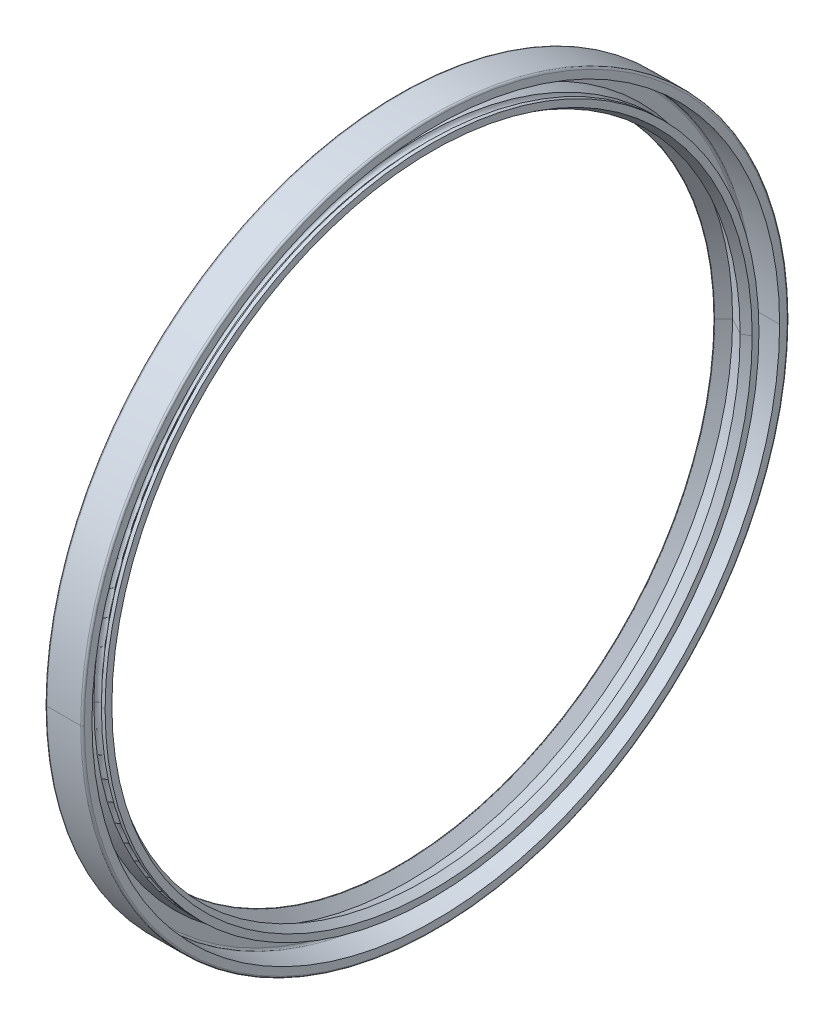
ISO-10303-21;
HEADER;
FILE_DESCRIPTION(('STEP AP214'),'2;1');
FILE_NAME('part.step','',(''),(''),'','','');
FILE_SCHEMA(('AUTOMOTIVE_DESIGN { 1 0 10303 214 1 1 1 1 }'));
ENDSEC;
DATA;
#1=APPLICATION_CONTEXT('core data for automotive mechanical design processes');
#2=APPLICATION_PROTOCOL_DEFINITION('international standard','automotive_design',2000,#1);
#3=PRODUCT_CONTEXT('',#1,'mechanical');
#4=PRODUCT('Part','Part','',(#3));
#5=PRODUCT_RELATED_PRODUCT_CATEGORY('part','',(#4));
#6=PRODUCT_DEFINITION_FORMATION('','',#4);
#7=PRODUCT_DEFINITION_CONTEXT('part definition',#1,'design');
#8=PRODUCT_DEFINITION('design','',#6,#7);
#9=PRODUCT_DEFINITION_SHAPE('','',#8);
#10=(LENGTH_UNIT() NAMED_UNIT(*) SI_UNIT(.MILLI.,.METRE.));
#11=(NAMED_UNIT(*) PLANE_ANGLE_UNIT() SI_UNIT($,.RADIAN.));
#12=(NAMED_UNIT(*) SI_UNIT($,.STERADIAN.) SOLID_ANGLE_UNIT());
#13=UNCERTAINTY_MEASURE_WITH_UNIT(LENGTH_MEASURE(1.E-05),#10,'distance_accuracy_value','');
#14=(GEOMETRIC_REPRESENTATION_CONTEXT(3) GLOBAL_UNCERTAINTY_ASSIGNED_CONTEXT((#13)) GLOBAL_UNIT_ASSIGNED_CONTEXT((#10,
#11,#12)) REPRESENTATION_CONTEXT('',''));
#15=CARTESIAN_POINT('',(0.,0.,0.));
#16=DIRECTION('',(0.,0.,1.));
#17=DIRECTION('',(1.,0.,0.));
#18=AXIS2_PLACEMENT_3D('',#15,#16,#17);
#19=CARTESIAN_POINT('',(0.,46.75,0.));
#20=DIRECTION('',(1.,0.,0.));
#21=DIRECTION('',(0.,1.,0.));
#22=AXIS2_PLACEMENT_3D('',#19,#20,#21);
#23=PLANE('',#22);
#24=CARTESIAN_POINT('',(0.,0.,0.));
#25=DIRECTION('',(-1.,0.,0.));
#26=DIRECTION('',(0.,0.,1.));
#27=AXIS2_PLACEMENT_3D('',#24,#25,#26);
#28=CIRCLE('',#27,42.055556);
#29=CARTESIAN_POINT('',(0.,0.,42.055556));
#30=VERTEX_POINT('',#29);
#31=CARTESIAN_POINT('',(0.,0.,-42.055556));
#32=VERTEX_POINT('',#31);
#33=EDGE_CURVE('E140',#30,#32,#28,.T.);
#34=ORIENTED_EDGE('',*,*,#33,.F.);
#35=CARTESIAN_POINT('',(0.,0.,0.));
#36=DIRECTION('',(-1.,0.,0.));
#37=DIRECTION('',(0.,0.,1.));
#38=AXIS2_PLACEMENT_3D('',#35,#36,#37);
#39=CIRCLE('',#38,42.055556);
#40=EDGE_CURVE('E38',#32,#30,#39,.T.);
#41=ORIENTED_EDGE('',*,*,#40,.F.);
#42=EDGE_LOOP('',(#34,#41));
#43=FACE_BOUND('',#42,.T.);
#44=CARTESIAN_POINT('',(0.,0.,0.));
#45=DIRECTION('',(-1.,0.,0.));
#46=DIRECTION('',(0.,0.,1.));
#47=AXIS2_PLACEMENT_3D('',#44,#45,#46);
#48=CIRCLE('',#47,46.75);
#49=CARTESIAN_POINT('',(0.,0.,46.75));
#50=VERTEX_POINT('',#49);
#51=CARTESIAN_POINT('',(0.,0.,-46.75));
#52=VERTEX_POINT('',#51);
#53=EDGE_CURVE('E235',#50,#52,#48,.T.);
#54=ORIENTED_EDGE('',*,*,#53,.T.);
#55=CARTESIAN_POINT('',(0.,0.,0.));
#56=DIRECTION('',(-1.,0.,0.));
#57=DIRECTION('',(0.,0.,1.));
#58=AXIS2_PLACEMENT_3D('',#55,#56,#57);
#59=CIRCLE('',#58,46.75);
#60=EDGE_CURVE('E11',#52,#50,#59,.T.);
#61=ORIENTED_EDGE('',*,*,#60,.T.);
#62=EDGE_LOOP('',(#54,#61));
#63=FACE_BOUND('',#62,.T.);
#64=ADVANCED_FACE('F17',(#43,#63),#23,.F.);
#65=CARTESIAN_POINT('',(0.25,0.,0.));
#66=DIRECTION('',(-1.,0.,0.));
#67=DIRECTION('',(0.,0.,1.));
#68=AXIS2_PLACEMENT_3D('',#65,#66,#67);
#69=TOROIDAL_SURFACE('',#68,46.75,0.25);
#70=CARTESIAN_POINT('',(0.25,0.,-46.75));
#71=DIRECTION('',(0.,1.,0.));
#72=DIRECTION('',(0.,0.,1.));
#73=AXIS2_PLACEMENT_3D('',#70,#71,#72);
#74=CIRCLE('',#73,0.25);
#75=CARTESIAN_POINT('',(0.25,0.,-47.));
#76=VERTEX_POINT('',#75);
#77=EDGE_CURVE('E212',#76,#52,#74,.T.);
#78=ORIENTED_EDGE('',*,*,#77,.F.);
#79=CARTESIAN_POINT('',(0.25,0.,0.));
#80=DIRECTION('',(-1.,0.,0.));
#81=DIRECTION('',(0.,0.,1.));
#82=AXIS2_PLACEMENT_3D('',#79,#80,#81);
#83=CIRCLE('',#82,47.);
#84=CARTESIAN_POINT('',(0.25,0.,47.));
#85=VERTEX_POINT('',#84);
#86=EDGE_CURVE('E26',#76,#85,#83,.T.);
#87=ORIENTED_EDGE('',*,*,#86,.T.);
#88=CARTESIAN_POINT('',(0.25,0.,46.75));
#89=DIRECTION('',(0.,-1.,0.));
#90=DIRECTION('',(0.,0.,-1.));
#91=AXIS2_PLACEMENT_3D('',#88,#89,#90);
#92=CIRCLE('',#91,0.25);
#93=EDGE_CURVE('E231',#85,#50,#92,.T.);
#94=ORIENTED_EDGE('',*,*,#93,.T.);
#95=ORIENTED_EDGE('',*,*,#60,.F.);
#96=EDGE_LOOP('',(#78,#87,#94,#95));
#97=FACE_BOUND('',#96,.T.);
#98=ADVANCED_FACE('F515',(#97),#69,.T.);
#99=CARTESIAN_POINT('',(0.,0.,0.));
#100=DIRECTION('',(-1.,0.,0.));
#101=DIRECTION('',(0.,0.,1.));
#102=AXIS2_PLACEMENT_3D('',#99,#100,#101);
#103=CYLINDRICAL_SURFACE('',#102,47.);
#104=DIRECTION('',(-1.,0.,0.));
#105=VECTOR('',#104,1.);
#106=CARTESIAN_POINT('',(0.,0.,-47.));
#107=LINE('',#106,#105);
#108=CARTESIAN_POINT('',(4.75,0.,-47.));
#109=VERTEX_POINT('',#108);
#110=EDGE_CURVE('E246',#109,#76,#107,.T.);
#111=ORIENTED_EDGE('',*,*,#110,.F.);
#112=CARTESIAN_POINT('',(4.75,0.,0.));
#113=DIRECTION('',(-1.,0.,0.));
#114=DIRECTION('',(0.,0.,1.));
#115=AXIS2_PLACEMENT_3D('',#112,#113,#114);
#116=CIRCLE('',#115,47.);
#117=CARTESIAN_POINT('',(4.75,0.,47.));
#118=VERTEX_POINT('',#117);
#119=EDGE_CURVE('E172',#109,#118,#116,.T.);
#120=ORIENTED_EDGE('',*,*,#119,.T.);
#121=DIRECTION('',(-1.,0.,0.));
#122=VECTOR('',#121,1.);
#123=CARTESIAN_POINT('',(0.,0.,47.));
#124=LINE('',#123,#122);
#125=EDGE_CURVE('E250',#118,#85,#124,.T.);
#126=ORIENTED_EDGE('',*,*,#125,.T.);
#127=ORIENTED_EDGE('',*,*,#86,.F.);
#128=EDGE_LOOP('',(#111,#120,#126,#127));
#129=FACE_BOUND('',#128,.T.);
#130=ADVANCED_FACE('F524',(#129),#103,.T.);
#131=CARTESIAN_POINT('',(4.75,0.,0.));
#132=DIRECTION('',(-1.,0.,0.));
#133=DIRECTION('',(0.,0.,1.));
#134=AXIS2_PLACEMENT_3D('',#131,#132,#133);
#135=TOROIDAL_SURFACE('',#134,46.75,0.25);
#136=CARTESIAN_POINT('',(4.75,0.,-46.75));
#137=DIRECTION('',(0.,1.,0.));
#138=DIRECTION('',(0.,0.,1.));
#139=AXIS2_PLACEMENT_3D('',#136,#137,#138);
#140=CIRCLE('',#139,0.25);
#141=CARTESIAN_POINT('',(5.,0.,-46.75));
#142=VERTEX_POINT('',#141);
#143=EDGE_CURVE('E259',#142,#109,#140,.T.);
#144=ORIENTED_EDGE('',*,*,#143,.F.);
#145=CARTESIAN_POINT('',(5.,0.,0.));
#146=DIRECTION('',(-1.,0.,0.));
#147=DIRECTION('',(0.,0.,1.));
#148=AXIS2_PLACEMENT_3D('',#145,#146,#147);
#149=CIRCLE('',#148,46.75);
#150=CARTESIAN_POINT('',(5.,0.,46.75));
#151=VERTEX_POINT('',#150);
#152=EDGE_CURVE('E169',#142,#151,#149,.T.);
#153=ORIENTED_EDGE('',*,*,#152,.T.);
#154=CARTESIAN_POINT('',(4.75,0.,46.75));
#155=DIRECTION('',(0.,-1.,0.));
#156=DIRECTION('',(0.,0.,-1.));
#157=AXIS2_PLACEMENT_3D('',#154,#155,#156);
#158=CIRCLE('',#157,0.25);
#159=EDGE_CURVE('E263',#151,#118,#158,.T.);
#160=ORIENTED_EDGE('',*,*,#159,.T.);
#161=ORIENTED_EDGE('',*,*,#119,.F.);
#162=EDGE_LOOP('',(#144,#153,#160,#161));
#163=FACE_BOUND('',#162,.T.);
#164=ADVANCED_FACE('F532',(#163),#135,.T.);
#165=CARTESIAN_POINT('',(5.,46.75,0.));
#166=DIRECTION('',(-1.,0.,0.));
#167=DIRECTION('',(0.,0.,1.));
#168=AXIS2_PLACEMENT_3D('',#165,#166,#167);
#169=PLANE('',#168);
#170=CARTESIAN_POINT('',(5.,0.,0.));
#171=DIRECTION('',(-1.,0.,0.));
#172=DIRECTION('',(0.,0.,1.));
#173=AXIS2_PLACEMENT_3D('',#170,#171,#172);
#174=CIRCLE('',#173,45.75);
#175=CARTESIAN_POINT('',(5.,0.,45.75));
#176=VERTEX_POINT('',#175);
#177=CARTESIAN_POINT('',(5.,0.,-45.75));
#178=VERTEX_POINT('',#177);
#179=EDGE_CURVE('E165',#176,#178,#174,.T.);
#180=ORIENTED_EDGE('',*,*,#179,.T.);
#181=CARTESIAN_POINT('',(5.,0.,0.));
#182=DIRECTION('',(-1.,0.,0.));
#183=DIRECTION('',(0.,0.,1.));
#184=AXIS2_PLACEMENT_3D('',#181,#182,#183);
#185=CIRCLE('',#184,45.75);
#186=EDGE_CURVE('E266',#178,#176,#185,.T.);
#187=ORIENTED_EDGE('',*,*,#186,.T.);
#188=EDGE_LOOP('',(#180,#187));
#189=FACE_BOUND('',#188,.T.);
#190=CARTESIAN_POINT('',(5.,0.,0.));
#191=DIRECTION('',(-1.,0.,0.));
#192=DIRECTION('',(0.,0.,1.));
#193=AXIS2_PLACEMENT_3D('',#190,#191,#192);
#194=CIRCLE('',#193,46.75);
#195=EDGE_CURVE('E255',#151,#142,#194,.T.);
#196=ORIENTED_EDGE('',*,*,#195,.F.);
#197=ORIENTED_EDGE('',*,*,#152,.F.);
#198=EDGE_LOOP('',(#196,#197));
#199=FACE_BOUND('',#198,.T.);
#200=ADVANCED_FACE('F541',(#189,#199),#169,.F.);
#201=CARTESIAN_POINT('',(0.,0.,0.));
#202=DIRECTION('',(-1.,0.,0.));
#203=DIRECTION('',(0.,0.,1.));
#204=AXIS2_PLACEMENT_3D('',#201,#202,#203);
#205=CYLINDRICAL_SURFACE('',#204,45.75);
#206=DIRECTION('',(-1.,0.,0.));
#207=VECTOR('',#206,1.);
#208=CARTESIAN_POINT('',(0.,0.,-45.75));
#209=LINE('',#208,#207);
#210=CARTESIAN_POINT('',(1.5,0.,-45.75));
#211=VERTEX_POINT('',#210);
#212=EDGE_CURVE('E270',#178,#211,#209,.T.);
#213=ORIENTED_EDGE('',*,*,#212,.F.);
#214=ORIENTED_EDGE('',*,*,#179,.F.);
#215=DIRECTION('',(-1.,0.,0.));
#216=VECTOR('',#215,1.);
#217=CARTESIAN_POINT('',(0.,0.,45.75));
#218=LINE('',#217,#216);
#219=CARTESIAN_POINT('',(1.5,0.,45.75));
#220=VERTEX_POINT('',#219);
#221=EDGE_CURVE('E278',#176,#220,#218,.T.);
#222=ORIENTED_EDGE('',*,*,#221,.T.);
#223=CARTESIAN_POINT('',(1.5,0.,0.));
#224=DIRECTION('',(-1.,0.,0.));
#225=DIRECTION('',(0.,0.,1.));
#226=AXIS2_PLACEMENT_3D('',#223,#224,#225);
#227=CIRCLE('',#226,45.75);
#228=EDGE_CURVE('E161',#220,#211,#227,.T.);
#229=ORIENTED_EDGE('',*,*,#228,.T.);
#230=EDGE_LOOP('',(#213,#214,#222,#229));
#231=FACE_BOUND('',#230,.T.);
#232=ADVANCED_FACE('F551',(#231),#205,.F.);
#233=CARTESIAN_POINT('',(1.5,0.,0.));
#234=DIRECTION('',(-1.,0.,0.));
#235=DIRECTION('',(0.,0.,1.));
#236=AXIS2_PLACEMENT_3D('',#233,#234,#235);
#237=TOROIDAL_SURFACE('',#236,45.5,0.25);
#238=CARTESIAN_POINT('',(1.5,0.,-45.5));
#239=DIRECTION('',(0.,1.,0.));
#240=DIRECTION('',(0.,0.,1.));
#241=AXIS2_PLACEMENT_3D('',#238,#239,#240);
#242=CIRCLE('',#241,0.25);
#243=CARTESIAN_POINT('',(1.25,0.,-45.5));
#244=VERTEX_POINT('',#243);
#245=EDGE_CURVE('E282',#211,#244,#242,.T.);
#246=ORIENTED_EDGE('',*,*,#245,.F.);
#247=ORIENTED_EDGE('',*,*,#228,.F.);
#248=CARTESIAN_POINT('',(1.5,0.,45.5));
#249=DIRECTION('',(0.,-1.,0.));
#250=DIRECTION('',(0.,0.,-1.));
#251=AXIS2_PLACEMENT_3D('',#248,#249,#250);
#252=CIRCLE('',#251,0.25);
#253=CARTESIAN_POINT('',(1.25,0.,45.5));
#254=VERTEX_POINT('',#253);
#255=EDGE_CURVE('E296',#220,#254,#252,.T.);
#256=ORIENTED_EDGE('',*,*,#255,.T.);
#257=CARTESIAN_POINT('',(1.25,0.,0.));
#258=DIRECTION('',(-1.,0.,0.));
#259=DIRECTION('',(0.,0.,1.));
#260=AXIS2_PLACEMENT_3D('',#257,#258,#259);
#261=CIRCLE('',#260,45.5);
#262=EDGE_CURVE('E157',#254,#244,#261,.T.);
#263=ORIENTED_EDGE('',*,*,#262,.T.);
#264=EDGE_LOOP('',(#246,#247,#256,#263));
#265=FACE_BOUND('',#264,.T.);
#266=ADVANCED_FACE('F561',(#265),#237,.F.);
#267=CARTESIAN_POINT('',(1.25,45.5,0.));
#268=DIRECTION('',(-1.,0.,0.));
#269=DIRECTION('',(0.,0.,1.));
#270=AXIS2_PLACEMENT_3D('',#267,#268,#269);
#271=PLANE('',#270);
#272=CARTESIAN_POINT('',(1.25,0.,0.));
#273=DIRECTION('',(-1.,0.,0.));
#274=DIRECTION('',(0.,0.,1.));
#275=AXIS2_PLACEMENT_3D('',#272,#273,#274);
#276=CIRCLE('',#275,43.8560415239915);
#277=CARTESIAN_POINT('',(1.25,0.,43.8560415239915));
#278=VERTEX_POINT('',#277);
#279=CARTESIAN_POINT('',(1.25,0.,-43.8560415239915));
#280=VERTEX_POINT('',#279);
#281=EDGE_CURVE('E303',#278,#280,#276,.T.);
#282=ORIENTED_EDGE('',*,*,#281,.T.);
#283=CARTESIAN_POINT('',(1.25,0.,0.));
#284=DIRECTION('',(-1.,0.,0.));
#285=DIRECTION('',(0.,0.,1.));
#286=AXIS2_PLACEMENT_3D('',#283,#284,#285);
#287=CIRCLE('',#286,43.8560415239915);
#288=EDGE_CURVE('E154',#280,#278,#287,.T.);
#289=ORIENTED_EDGE('',*,*,#288,.T.);
#290=EDGE_LOOP('',(#282,#289));
#291=FACE_BOUND('',#290,.T.);
#292=ORIENTED_EDGE('',*,*,#262,.F.);
#293=CARTESIAN_POINT('',(1.25,0.,0.));
#294=DIRECTION('',(-1.,0.,0.));
#295=DIRECTION('',(0.,0.,1.));
#296=AXIS2_PLACEMENT_3D('',#293,#294,#295);
#297=CIRCLE('',#296,45.5);
#298=EDGE_CURVE('E286',#244,#254,#297,.T.);
#299=ORIENTED_EDGE('',*,*,#298,.F.);
#300=EDGE_LOOP('',(#292,#299));
#301=FACE_BOUND('',#300,.T.);
#302=ADVANCED_FACE('F463',(#291,#301),#271,.F.);
#303=CARTESIAN_POINT('',(3.,0.,0.));
#304=DIRECTION('',(-1.,0.,0.));
#305=DIRECTION('',(0.,0.,1.));
#306=AXIS2_PLACEMENT_3D('',#303,#304,#305);
#307=CONICAL_SURFACE('',#306,43.5,0.200712863979365);
#308=DIRECTION('',(-0.979924704620826,0.,-0.199367934417214));
#309=VECTOR('',#308,1.);
#310=CARTESIAN_POINT('',(3.,0.,-43.5));
#311=LINE('',#310,#309);
#312=CARTESIAN_POINT('',(3.,0.,-43.5));
#313=VERTEX_POINT('',#312);
#314=EDGE_CURVE('E300',#313,#280,#311,.T.);
#315=ORIENTED_EDGE('',*,*,#314,.F.);
#316=CARTESIAN_POINT('',(3.,0.,0.));
#317=DIRECTION('',(-1.,0.,0.));
#318=DIRECTION('',(0.,0.,1.));
#319=AXIS2_PLACEMENT_3D('',#316,#317,#318);
#320=CIRCLE('',#319,43.5);
#321=CARTESIAN_POINT('',(3.,0.,43.5));
#322=VERTEX_POINT('',#321);
#323=EDGE_CURVE('E213',#313,#322,#320,.T.);
#324=ORIENTED_EDGE('',*,*,#323,.T.);
#325=DIRECTION('',(-0.979924704620826,0.,0.199367934417214));
#326=VECTOR('',#325,1.);
#327=CARTESIAN_POINT('',(3.,0.,43.5));
#328=LINE('',#327,#326);
#329=EDGE_CURVE('E308',#322,#278,#328,.T.);
#330=ORIENTED_EDGE('',*,*,#329,.T.);
#331=ORIENTED_EDGE('',*,*,#288,.F.);
#332=EDGE_LOOP('',(#315,#324,#330,#331));
#333=FACE_BOUND('',#332,.T.);
#334=ADVANCED_FACE('F459',(#333),#307,.T.);
#335=CARTESIAN_POINT('',(3.5,0.,0.));
#336=DIRECTION('',(-1.,0.,0.));
#337=DIRECTION('',(0.,0.,1.));
#338=AXIS2_PLACEMENT_3D('',#335,#336,#337);
#339=TOROIDAL_SURFACE('',#338,43.5,0.5);
#340=CARTESIAN_POINT('',(3.5,0.,0.));
#341=DIRECTION('',(-1.,0.,0.));
#342=DIRECTION('',(0.,0.,1.));
#343=AXIS2_PLACEMENT_3D('',#340,#341,#342);
#344=CIRCLE('',#343,43.);
#345=CARTESIAN_POINT('',(3.5,0.,43.));
#346=VERTEX_POINT('',#345);
#347=CARTESIAN_POINT('',(3.5,0.,-43.));
#348=VERTEX_POINT('',#347);
#349=EDGE_CURVE('E478',#346,#348,#344,.T.);
#350=ORIENTED_EDGE('',*,*,#349,.F.);
#351=CARTESIAN_POINT('',(3.5,0.,43.5));
#352=DIRECTION('',(0.,-1.,0.));
#353=DIRECTION('',(0.,0.,-1.));
#354=AXIS2_PLACEMENT_3D('',#351,#352,#353);
#355=CIRCLE('',#354,0.5);
#356=CARTESIAN_POINT('',(4.,0.,43.5));
#357=VERTEX_POINT('',#356);
#358=EDGE_CURVE('E287',#346,#357,#355,.T.);
#359=ORIENTED_EDGE('',*,*,#358,.T.);
#360=CARTESIAN_POINT('',(4.,0.,0.));
#361=DIRECTION('',(-1.,0.,0.));
#362=DIRECTION('',(0.,0.,1.));
#363=AXIS2_PLACEMENT_3D('',#360,#361,#362);
#364=CIRCLE('',#363,43.5);
#365=CARTESIAN_POINT('',(4.,0.,-43.5));
#366=VERTEX_POINT('',#365);
#367=EDGE_CURVE('E329',#357,#366,#364,.T.);
#368=ORIENTED_EDGE('',*,*,#367,.T.);
#369=CARTESIAN_POINT('',(3.5,0.,-43.5));
#370=DIRECTION('',(0.,1.,0.));
#371=DIRECTION('',(0.,0.,1.));
#372=AXIS2_PLACEMENT_3D('',#369,#370,#371);
#373=CIRCLE('',#372,0.5);
#374=EDGE_CURVE('E312',#348,#366,#373,.T.);
#375=ORIENTED_EDGE('',*,*,#374,.F.);
#376=EDGE_LOOP('',(#350,#359,#368,#375));
#377=FACE_BOUND('',#376,.T.);
#378=ADVANCED_FACE('F494',(#377),#339,.F.);
#379=CARTESIAN_POINT('',(0.,0.,0.));
#380=DIRECTION('',(-1.,0.,0.));
#381=DIRECTION('',(0.,0.,1.));
#382=AXIS2_PLACEMENT_3D('',#379,#380,#381);
#383=CYLINDRICAL_SURFACE('',#382,43.5);
#384=DIRECTION('',(-1.,0.,0.));
#385=VECTOR('',#384,1.);
#386=CARTESIAN_POINT('',(0.,0.,-43.5));
#387=LINE('',#386,#385);
#388=CARTESIAN_POINT('',(4.5,0.,-43.5));
#389=VERTEX_POINT('',#388);
#390=EDGE_CURVE('E322',#389,#366,#387,.T.);
#391=ORIENTED_EDGE('',*,*,#390,.F.);
#392=CARTESIAN_POINT('',(4.5,0.,0.));
#393=DIRECTION('',(-1.,0.,0.));
#394=DIRECTION('',(0.,0.,1.));
#395=AXIS2_PLACEMENT_3D('',#392,#393,#394);
#396=CIRCLE('',#395,43.5);
#397=CARTESIAN_POINT('',(4.5,0.,43.5));
#398=VERTEX_POINT('',#397);
#399=EDGE_CURVE('E150',#389,#398,#396,.T.);
#400=ORIENTED_EDGE('',*,*,#399,.T.);
#401=DIRECTION('',(-1.,0.,0.));
#402=VECTOR('',#401,1.);
#403=CARTESIAN_POINT('',(0.,0.,43.5));
#404=LINE('',#403,#402);
#405=EDGE_CURVE('E331',#398,#357,#404,.T.);
#406=ORIENTED_EDGE('',*,*,#405,.T.);
#407=CARTESIAN_POINT('',(4.,0.,0.));
#408=DIRECTION('',(-1.,0.,0.));
#409=DIRECTION('',(0.,0.,1.));
#410=AXIS2_PLACEMENT_3D('',#407,#408,#409);
#411=CIRCLE('',#410,43.5);
#412=EDGE_CURVE('E292',#366,#357,#411,.T.);
#413=ORIENTED_EDGE('',*,*,#412,.F.);
#414=EDGE_LOOP('',(#391,#400,#406,#413));
#415=FACE_BOUND('',#414,.T.);
#416=ADVANCED_FACE('F497',(#415),#383,.T.);
#417=CARTESIAN_POINT('',(4.5,43.5,0.));
#418=DIRECTION('',(-1.,0.,0.));
#419=DIRECTION('',(0.,0.,1.));
#420=AXIS2_PLACEMENT_3D('',#417,#418,#419);
#421=PLANE('',#420);
#422=CARTESIAN_POINT('',(4.5,0.,0.));
#423=DIRECTION('',(-1.,0.,0.));
#424=DIRECTION('',(0.,0.,1.));
#425=AXIS2_PLACEMENT_3D('',#422,#423,#424);
#426=CIRCLE('',#425,42.6008606190276);
#427=CARTESIAN_POINT('',(4.5,0.,-42.6008606190276));
#428=VERTEX_POINT('',#427);
#429=CARTESIAN_POINT('',(4.5,0.,42.6008606190276));
#430=VERTEX_POINT('',#429);
#431=EDGE_CURVE('E217',#428,#430,#426,.T.);
#432=ORIENTED_EDGE('',*,*,#431,.T.);
#433=CARTESIAN_POINT('',(4.5,0.,0.));
#434=DIRECTION('',(-1.,0.,0.));
#435=DIRECTION('',(0.,0.,1.));
#436=AXIS2_PLACEMENT_3D('',#433,#434,#435);
#437=CIRCLE('',#436,42.6008606190276);
#438=EDGE_CURVE('E147',#430,#428,#437,.T.);
#439=ORIENTED_EDGE('',*,*,#438,.T.);
#440=EDGE_LOOP('',(#432,#439));
#441=FACE_BOUND('',#440,.T.);
#442=CARTESIAN_POINT('',(4.5,0.,0.));
#443=DIRECTION('',(-1.,0.,0.));
#444=DIRECTION('',(0.,0.,1.));
#445=AXIS2_PLACEMENT_3D('',#442,#443,#444);
#446=CIRCLE('',#445,43.5);
#447=EDGE_CURVE('E291',#398,#389,#446,.T.);
#448=ORIENTED_EDGE('',*,*,#447,.F.);
#449=ORIENTED_EDGE('',*,*,#399,.F.);
#450=EDGE_LOOP('',(#448,#449));
#451=FACE_BOUND('',#450,.T.);
#452=ADVANCED_FACE('F502',(#441,#451),#421,.F.);
#453=CARTESIAN_POINT('',(3.5,0.,0.));
#454=DIRECTION('',(1.,0.,0.));
#455=DIRECTION('',(0.,0.,-1.));
#456=AXIS2_PLACEMENT_3D('',#453,#454,#455);
#457=CONICAL_SURFACE('',#456,42.,0.541052068118247);
#458=DIRECTION('',(0.85716730070211,0.,0.515038074910058));
#459=VECTOR('',#458,1.);
#460=CARTESIAN_POINT('',(3.5,0.,42.));
#461=LINE('',#460,#459);
#462=CARTESIAN_POINT('',(3.5,0.,42.));
#463=VERTEX_POINT('',#462);
#464=EDGE_CURVE('E242',#463,#430,#461,.T.);
#465=ORIENTED_EDGE('',*,*,#464,.F.);
#466=CARTESIAN_POINT('',(3.5,0.,0.));
#467=DIRECTION('',(-1.,0.,0.));
#468=DIRECTION('',(0.,0.,1.));
#469=AXIS2_PLACEMENT_3D('',#466,#467,#468);
#470=CIRCLE('',#469,42.);
#471=CARTESIAN_POINT('',(3.5,0.,-42.));
#472=VERTEX_POINT('',#471);
#473=EDGE_CURVE('E99',#463,#472,#470,.T.);
#474=ORIENTED_EDGE('',*,*,#473,.T.);
#475=DIRECTION('',(0.85716730070211,0.,-0.515038074910058));
#476=VECTOR('',#475,1.);
#477=CARTESIAN_POINT('',(3.5,0.,-42.));
#478=LINE('',#477,#476);
#479=EDGE_CURVE('E129',#472,#428,#478,.T.);
#480=ORIENTED_EDGE('',*,*,#479,.T.);
#481=ORIENTED_EDGE('',*,*,#438,.F.);
#482=EDGE_LOOP('',(#465,#474,#480,#481));
#483=FACE_BOUND('',#482,.T.);
#484=ADVANCED_FACE('F603',(#483),#457,.F.);
#485=CARTESIAN_POINT('',(1.25,0.,0.));
#486=DIRECTION('',(-1.,0.,0.));
#487=DIRECTION('',(0.,0.,1.));
#488=AXIS2_PLACEMENT_3D('',#485,#486,#487);
#489=CONICAL_SURFACE('',#488,43.25,0.507098504392337);
#490=DIRECTION('',(-0.874157276121538,0.,-0.485642931178632));
#491=VECTOR('',#490,1.);
#492=CARTESIAN_POINT('',(1.25,0.,-43.25));
#493=LINE('',#492,#491);
#494=CARTESIAN_POINT('',(1.25,0.,-43.25));
#495=VERTEX_POINT('',#494);
#496=EDGE_CURVE('E121',#472,#495,#493,.T.);
#497=ORIENTED_EDGE('',*,*,#496,.F.);
#498=ORIENTED_EDGE('',*,*,#473,.F.);
#499=DIRECTION('',(-0.874157276121538,0.,0.485642931178632));
#500=VECTOR('',#499,1.);
#501=CARTESIAN_POINT('',(1.25,0.,43.25));
#502=LINE('',#501,#500);
#503=CARTESIAN_POINT('',(1.25,0.,43.25));
#504=VERTEX_POINT('',#503);
#505=EDGE_CURVE('E111',#463,#504,#502,.T.);
#506=ORIENTED_EDGE('',*,*,#505,.T.);
#507=CARTESIAN_POINT('',(1.25,0.,0.));
#508=DIRECTION('',(-1.,0.,0.));
#509=DIRECTION('',(0.,0.,1.));
#510=AXIS2_PLACEMENT_3D('',#507,#508,#509);
#511=CIRCLE('',#510,43.25);
#512=EDGE_CURVE('E85',#504,#495,#511,.T.);
#513=ORIENTED_EDGE('',*,*,#512,.T.);
#514=EDGE_LOOP('',(#497,#498,#506,#513));
#515=FACE_BOUND('',#514,.T.);
#516=ADVANCED_FACE('F114',(#515),#489,.F.);
#517=CARTESIAN_POINT('',(0.0961107829558188,0.,0.));
#518=DIRECTION('',(1.,0.,0.));
#519=DIRECTION('',(0.,0.,-1.));
#520=AXIS2_PLACEMENT_3D('',#517,#518,#519);
#521=CONICAL_SURFACE('',#520,42.0175852386776,0.818293058373164);
#522=DIRECTION('',(0.683468236057039,0.,0.729980253363801));
#523=VECTOR('',#522,1.);
#524=CARTESIAN_POINT('',(0.0961107829558188,0.,42.0175852386776));
#525=LINE('',#524,#523);
#526=CARTESIAN_POINT('',(0.0961107829558187,0.,42.0175852386776));
#527=VERTEX_POINT('',#526);
#528=EDGE_CURVE('E90',#527,#504,#525,.T.);
#529=ORIENTED_EDGE('',*,*,#528,.F.);
#530=CARTESIAN_POINT('',(0.0961107829558188,0.,0.));
#531=DIRECTION('',(-1.,0.,0.));
#532=DIRECTION('',(0.,0.,1.));
#533=AXIS2_PLACEMENT_3D('',#530,#531,#532);
#534=CIRCLE('',#533,42.0175852386776);
#535=CARTESIAN_POINT('',(0.0961107829558187,0.,-42.0175852386776));
#536=VERTEX_POINT('',#535);
#537=EDGE_CURVE('E218',#527,#536,#534,.T.);
#538=ORIENTED_EDGE('',*,*,#537,.T.);
#539=DIRECTION('',(0.683468236057039,0.,-0.729980253363801));
#540=VECTOR('',#539,1.);
#541=CARTESIAN_POINT('',(0.0961107829558188,0.,-42.0175852386776));
#542=LINE('',#541,#540);
#543=EDGE_CURVE('E93',#536,#495,#542,.T.);
#544=ORIENTED_EDGE('',*,*,#543,.T.);
#545=ORIENTED_EDGE('',*,*,#512,.F.);
#546=EDGE_LOOP('',(#529,#538,#544,#545));
#547=FACE_BOUND('',#546,.T.);
#548=ADVANCED_FACE('F87',(#547),#521,.F.);
#549=CARTESIAN_POINT('',(0.0480553914779094,0.,0.));
#550=DIRECTION('',(-1.,0.,0.));
#551=DIRECTION('',(0.,0.,1.));
#552=AXIS2_PLACEMENT_3D('',#549,#550,#551);
#553=TOROIDAL_SURFACE('',#552,42.0365706193388,0.0516697719072371);
#554=CARTESIAN_POINT('',(0.0480553914779094,0.,0.));
#555=DIRECTION('',(-1.,0.,0.));
#556=DIRECTION('',(0.,0.,1.));
#557=AXIS2_PLACEMENT_3D('',#554,#555,#556);
#558=CIRCLE('',#557,41.9849008474316);
#559=CARTESIAN_POINT('',(0.0480553914779094,0.,-41.9849008474316));
#560=VERTEX_POINT('',#559);
#561=CARTESIAN_POINT('',(0.0480553914779094,0.,41.9849008474316));
#562=VERTEX_POINT('',#561);
#563=EDGE_CURVE('E202',#560,#562,#558,.T.);
#564=ORIENTED_EDGE('',*,*,#563,.F.);
#565=CARTESIAN_POINT('',(0.0480553914779094,0.,-42.0365706193388));
#566=DIRECTION('',(0.,1.,0.));
#567=DIRECTION('',(0.,0.,1.));
#568=AXIS2_PLACEMENT_3D('',#565,#566,#567);
#569=CIRCLE('',#568,0.0516697719072368);
#570=EDGE_CURVE('E144',#32,#560,#569,.T.);
#571=ORIENTED_EDGE('',*,*,#570,.F.);
#572=ORIENTED_EDGE('',*,*,#40,.T.);
#573=CARTESIAN_POINT('',(0.0480553914779094,0.,42.0365706193388));
#574=DIRECTION('',(0.,-1.,0.));
#575=DIRECTION('',(0.,0.,-1.));
#576=AXIS2_PLACEMENT_3D('',#573,#574,#575);
#577=CIRCLE('',#576,0.0516697719072368);
#578=EDGE_CURVE('E136',#30,#562,#577,.T.);
#579=ORIENTED_EDGE('',*,*,#578,.T.);
#580=EDGE_LOOP('',(#564,#571,#572,#579));
#581=FACE_BOUND('',#580,.T.);
#582=ADVANCED_FACE('F629',(#581),#553,.T.);
#583=CARTESIAN_POINT('',(0.0480553914779094,0.,0.));
#584=DIRECTION('',(-1.,0.,0.));
#585=DIRECTION('',(0.,0.,1.));
#586=AXIS2_PLACEMENT_3D('',#583,#584,#585);
#587=TOROIDAL_SURFACE('',#586,42.0365706193388,0.0516697719072371);
#588=CARTESIAN_POINT('',(0.0480553914779094,0.,0.));
#589=DIRECTION('',(-1.,0.,0.));
#590=DIRECTION('',(0.,0.,1.));
#591=AXIS2_PLACEMENT_3D('',#588,#589,#590);
#592=CIRCLE('',#591,41.9849008474316);
#593=EDGE_CURVE('E222',#562,#560,#592,.T.);
#594=ORIENTED_EDGE('',*,*,#593,.F.);
#595=ORIENTED_EDGE('',*,*,#578,.F.);
#596=ORIENTED_EDGE('',*,*,#33,.T.);
#597=ORIENTED_EDGE('',*,*,#570,.T.);
#598=EDGE_LOOP('',(#594,#595,#596,#597));
#599=FACE_BOUND('',#598,.T.);
#600=ADVANCED_FACE('F638',(#599),#587,.T.);
#601=CARTESIAN_POINT('',(0.0961107829558188,0.,0.));
#602=DIRECTION('',(1.,0.,0.));
#603=DIRECTION('',(0.,0.,-1.));
#604=AXIS2_PLACEMENT_3D('',#601,#602,#603);
#605=CONICAL_SURFACE('',#604,42.0175852386776,0.818293058373164);
#606=CARTESIAN_POINT('',(0.0961107829558188,0.,0.));
#607=DIRECTION('',(-1.,0.,0.));
#608=DIRECTION('',(0.,0.,1.));
#609=AXIS2_PLACEMENT_3D('',#606,#607,#608);
#610=CIRCLE('',#609,42.0175852386776);
#611=EDGE_CURVE('E108',#536,#527,#610,.T.);
#612=ORIENTED_EDGE('',*,*,#611,.T.);
#613=ORIENTED_EDGE('',*,*,#528,.T.);
#614=CARTESIAN_POINT('',(1.25,0.,0.));
#615=DIRECTION('',(-1.,0.,0.));
#616=DIRECTION('',(0.,0.,1.));
#617=AXIS2_PLACEMENT_3D('',#614,#615,#616);
#618=CIRCLE('',#617,43.25);
#619=EDGE_CURVE('E105',#495,#504,#618,.T.);
#620=ORIENTED_EDGE('',*,*,#619,.F.);
#621=ORIENTED_EDGE('',*,*,#543,.F.);
#622=EDGE_LOOP('',(#612,#613,#620,#621));
#623=FACE_BOUND('',#622,.T.);
#624=ADVANCED_FACE('F103',(#623),#605,.F.);
#625=CARTESIAN_POINT('',(1.25,0.,0.));
#626=DIRECTION('',(-1.,0.,0.));
#627=DIRECTION('',(0.,0.,1.));
#628=AXIS2_PLACEMENT_3D('',#625,#626,#627);
#629=CONICAL_SURFACE('',#628,43.25,0.507098504392337);
#630=CARTESIAN_POINT('',(3.5,0.,0.));
#631=DIRECTION('',(-1.,0.,0.));
#632=DIRECTION('',(0.,0.,1.));
#633=AXIS2_PLACEMENT_3D('',#630,#631,#632);
#634=CIRCLE('',#633,42.);
#635=EDGE_CURVE('E133',#472,#463,#634,.T.);
#636=ORIENTED_EDGE('',*,*,#635,.F.);
#637=ORIENTED_EDGE('',*,*,#496,.T.);
#638=ORIENTED_EDGE('',*,*,#619,.T.);
#639=ORIENTED_EDGE('',*,*,#505,.F.);
#640=EDGE_LOOP('',(#636,#637,#638,#639));
#641=FACE_BOUND('',#640,.T.);
#642=ADVANCED_FACE('F120',(#641),#629,.F.);
#643=CARTESIAN_POINT('',(3.5,0.,0.));
#644=DIRECTION('',(1.,0.,0.));
#645=DIRECTION('',(0.,0.,-1.));
#646=AXIS2_PLACEMENT_3D('',#643,#644,#645);
#647=CONICAL_SURFACE('',#646,42.,0.541052068118247);
#648=ORIENTED_EDGE('',*,*,#635,.T.);
#649=ORIENTED_EDGE('',*,*,#464,.T.);
#650=ORIENTED_EDGE('',*,*,#431,.F.);
#651=ORIENTED_EDGE('',*,*,#479,.F.);
#652=EDGE_LOOP('',(#648,#649,#650,#651));
#653=FACE_BOUND('',#652,.T.);
#654=ADVANCED_FACE('F691',(#653),#647,.F.);
#655=CARTESIAN_POINT('',(0.,0.,0.));
#656=DIRECTION('',(-1.,0.,0.));
#657=DIRECTION('',(0.,0.,1.));
#658=AXIS2_PLACEMENT_3D('',#655,#656,#657);
#659=CYLINDRICAL_SURFACE('',#658,43.5);
#660=ORIENTED_EDGE('',*,*,#447,.T.);
#661=ORIENTED_EDGE('',*,*,#390,.T.);
#662=ORIENTED_EDGE('',*,*,#367,.F.);
#663=ORIENTED_EDGE('',*,*,#405,.F.);
#664=EDGE_LOOP('',(#660,#661,#662,#663));
#665=FACE_BOUND('',#664,.T.);
#666=ADVANCED_FACE('F500',(#665),#659,.T.);
#667=CARTESIAN_POINT('',(3.5,0.,0.));
#668=DIRECTION('',(-1.,0.,0.));
#669=DIRECTION('',(0.,0.,1.));
#670=AXIS2_PLACEMENT_3D('',#667,#668,#669);
#671=TOROIDAL_SURFACE('',#670,43.5,0.5);
#672=CARTESIAN_POINT('',(3.5,0.,0.));
#673=DIRECTION('',(-1.,0.,0.));
#674=DIRECTION('',(0.,0.,1.));
#675=AXIS2_PLACEMENT_3D('',#672,#673,#674);
#676=CIRCLE('',#675,43.);
#677=EDGE_CURVE('E221',#348,#346,#676,.T.);
#678=ORIENTED_EDGE('',*,*,#677,.F.);
#679=ORIENTED_EDGE('',*,*,#374,.T.);
#680=ORIENTED_EDGE('',*,*,#412,.T.);
#681=ORIENTED_EDGE('',*,*,#358,.F.);
#682=EDGE_LOOP('',(#678,#679,#680,#681));
#683=FACE_BOUND('',#682,.T.);
#684=ADVANCED_FACE('F495',(#683),#671,.F.);
#685=CARTESIAN_POINT('',(3.,0.,0.));
#686=DIRECTION('',(-1.,0.,0.));
#687=DIRECTION('',(0.,0.,1.));
#688=AXIS2_PLACEMENT_3D('',#685,#686,#687);
#689=CONICAL_SURFACE('',#688,43.5,0.200712863979365);
#690=CARTESIAN_POINT('',(3.,0.,0.));
#691=DIRECTION('',(-1.,0.,0.));
#692=DIRECTION('',(0.,0.,1.));
#693=AXIS2_PLACEMENT_3D('',#690,#691,#692);
#694=CIRCLE('',#693,43.5);
#695=EDGE_CURVE('E203',#322,#313,#694,.T.);
#696=ORIENTED_EDGE('',*,*,#695,.T.);
#697=ORIENTED_EDGE('',*,*,#314,.T.);
#698=ORIENTED_EDGE('',*,*,#281,.F.);
#699=ORIENTED_EDGE('',*,*,#329,.F.);
#700=EDGE_LOOP('',(#696,#697,#698,#699));
#701=FACE_BOUND('',#700,.T.);
#702=ADVANCED_FACE('F466',(#701),#689,.T.);
#703=CARTESIAN_POINT('',(1.5,0.,0.));
#704=DIRECTION('',(-1.,0.,0.));
#705=DIRECTION('',(0.,0.,1.));
#706=AXIS2_PLACEMENT_3D('',#703,#704,#705);
#707=TOROIDAL_SURFACE('',#706,45.5,0.25);
#708=CARTESIAN_POINT('',(1.5,0.,0.));
#709=DIRECTION('',(-1.,0.,0.));
#710=DIRECTION('',(0.,0.,1.));
#711=AXIS2_PLACEMENT_3D('',#708,#709,#710);
#712=CIRCLE('',#711,45.75);
#713=EDGE_CURVE('E273',#211,#220,#712,.T.);
#714=ORIENTED_EDGE('',*,*,#713,.F.);
#715=ORIENTED_EDGE('',*,*,#245,.T.);
#716=ORIENTED_EDGE('',*,*,#298,.T.);
#717=ORIENTED_EDGE('',*,*,#255,.F.);
#718=EDGE_LOOP('',(#714,#715,#716,#717));
#719=FACE_BOUND('',#718,.T.);
#720=ADVANCED_FACE('F647',(#719),#707,.F.);
#721=CARTESIAN_POINT('',(0.,0.,0.));
#722=DIRECTION('',(-1.,0.,0.));
#723=DIRECTION('',(0.,0.,1.));
#724=AXIS2_PLACEMENT_3D('',#721,#722,#723);
#725=CYLINDRICAL_SURFACE('',#724,45.75);
#726=ORIENTED_EDGE('',*,*,#186,.F.);
#727=ORIENTED_EDGE('',*,*,#212,.T.);
#728=ORIENTED_EDGE('',*,*,#713,.T.);
#729=ORIENTED_EDGE('',*,*,#221,.F.);
#730=EDGE_LOOP('',(#726,#727,#728,#729));
#731=FACE_BOUND('',#730,.T.);
#732=ADVANCED_FACE('F656',(#731),#725,.F.);
#733=CARTESIAN_POINT('',(4.75,0.,0.));
#734=DIRECTION('',(-1.,0.,0.));
#735=DIRECTION('',(0.,0.,1.));
#736=AXIS2_PLACEMENT_3D('',#733,#734,#735);
#737=TOROIDAL_SURFACE('',#736,46.75,0.25);
#738=ORIENTED_EDGE('',*,*,#195,.T.);
#739=ORIENTED_EDGE('',*,*,#143,.T.);
#740=CARTESIAN_POINT('',(4.75,0.,0.));
#741=DIRECTION('',(-1.,0.,0.));
#742=DIRECTION('',(0.,0.,1.));
#743=AXIS2_PLACEMENT_3D('',#740,#741,#742);
#744=CIRCLE('',#743,47.);
#745=EDGE_CURVE('E234',#118,#109,#744,.T.);
#746=ORIENTED_EDGE('',*,*,#745,.F.);
#747=ORIENTED_EDGE('',*,*,#159,.F.);
#748=EDGE_LOOP('',(#738,#739,#746,#747));
#749=FACE_BOUND('',#748,.T.);
#750=ADVANCED_FACE('F666',(#749),#737,.T.);
#751=CARTESIAN_POINT('',(0.,0.,0.));
#752=DIRECTION('',(-1.,0.,0.));
#753=DIRECTION('',(0.,0.,1.));
#754=AXIS2_PLACEMENT_3D('',#751,#752,#753);
#755=CYLINDRICAL_SURFACE('',#754,47.);
#756=ORIENTED_EDGE('',*,*,#745,.T.);
#757=ORIENTED_EDGE('',*,*,#110,.T.);
#758=CARTESIAN_POINT('',(0.25,0.,0.));
#759=DIRECTION('',(-1.,0.,0.));
#760=DIRECTION('',(0.,0.,1.));
#761=AXIS2_PLACEMENT_3D('',#758,#759,#760);
#762=CIRCLE('',#761,47.);
#763=EDGE_CURVE('E208',#85,#76,#762,.T.);
#764=ORIENTED_EDGE('',*,*,#763,.F.);
#765=ORIENTED_EDGE('',*,*,#125,.F.);
#766=EDGE_LOOP('',(#756,#757,#764,#765));
#767=FACE_BOUND('',#766,.T.);
#768=ADVANCED_FACE('F684',(#767),#755,.T.);
#769=CARTESIAN_POINT('',(0.25,0.,0.));
#770=DIRECTION('',(-1.,0.,0.));
#771=DIRECTION('',(0.,0.,1.));
#772=AXIS2_PLACEMENT_3D('',#769,#770,#771);
#773=TOROIDAL_SURFACE('',#772,46.75,0.25);
#774=ORIENTED_EDGE('',*,*,#763,.T.);
#775=ORIENTED_EDGE('',*,*,#77,.T.);
#776=ORIENTED_EDGE('',*,*,#53,.F.);
#777=ORIENTED_EDGE('',*,*,#93,.F.);
#778=EDGE_LOOP('',(#774,#775,#776,#777));
#779=FACE_BOUND('',#778,.T.);
#780=ADVANCED_FACE('F703',(#779),#773,.T.);
#781=CARTESIAN_POINT('',(3.5,0.,0.));
#782=DIRECTION('',(-1.,0.,0.));
#783=DIRECTION('',(0.,0.,1.));
#784=AXIS2_PLACEMENT_3D('',#781,#782,#783);
#785=TOROIDAL_SURFACE('',#784,43.5,0.5);
#786=CARTESIAN_POINT('',(3.5,0.,-43.5));
#787=DIRECTION('',(0.,1.,0.));
#788=DIRECTION('',(0.,0.,1.));
#789=AXIS2_PLACEMENT_3D('',#786,#787,#788);
#790=CIRCLE('',#789,0.5);
#791=EDGE_CURVE('E197',#313,#348,#790,.T.);
#792=ORIENTED_EDGE('',*,*,#791,.T.);
#793=ORIENTED_EDGE('',*,*,#677,.T.);
#794=CARTESIAN_POINT('',(3.5,0.,43.5));
#795=DIRECTION('',(0.,-1.,0.));
#796=DIRECTION('',(0.,0.,-1.));
#797=AXIS2_PLACEMENT_3D('',#794,#795,#796);
#798=CIRCLE('',#797,0.5);
#799=EDGE_CURVE('E483',#322,#346,#798,.T.);
#800=ORIENTED_EDGE('',*,*,#799,.F.);
#801=ORIENTED_EDGE('',*,*,#323,.F.);
#802=EDGE_LOOP('',(#792,#793,#800,#801));
#803=FACE_BOUND('',#802,.T.);
#804=ADVANCED_FACE('F490',(#803),#785,.F.);
#805=CARTESIAN_POINT('',(0.0480553914779094,0.,0.));
#806=DIRECTION('',(-1.,0.,0.));
#807=DIRECTION('',(0.,0.,1.));
#808=AXIS2_PLACEMENT_3D('',#805,#806,#807);
#809=TOROIDAL_SURFACE('',#808,42.0365706193388,0.0516697719072371);
#810=CARTESIAN_POINT('',(0.0480553914779094,0.,42.0365706193388));
#811=DIRECTION('',(0.,-1.,0.));
#812=DIRECTION('',(0.,0.,-1.));
#813=AXIS2_PLACEMENT_3D('',#810,#811,#812);
#814=CIRCLE('',#813,0.0516697719072368);
#815=EDGE_CURVE('E207',#562,#527,#814,.T.);
#816=ORIENTED_EDGE('',*,*,#815,.F.);
#817=ORIENTED_EDGE('',*,*,#593,.T.);
#818=CARTESIAN_POINT('',(0.0480553914779094,0.,-42.0365706193388));
#819=DIRECTION('',(0.,1.,0.));
#820=DIRECTION('',(0.,0.,1.));
#821=AXIS2_PLACEMENT_3D('',#818,#819,#820);
#822=CIRCLE('',#821,0.0516697719072368);
#823=EDGE_CURVE('E199',#560,#536,#822,.T.);
#824=ORIENTED_EDGE('',*,*,#823,.T.);
#825=ORIENTED_EDGE('',*,*,#537,.F.);
#826=EDGE_LOOP('',(#816,#817,#824,#825));
#827=FACE_BOUND('',#826,.T.);
#828=ADVANCED_FACE('F370',(#827),#809,.T.);
#829=CARTESIAN_POINT('',(0.0480553914779094,0.,0.));
#830=DIRECTION('',(-1.,0.,0.));
#831=DIRECTION('',(0.,0.,1.));
#832=AXIS2_PLACEMENT_3D('',#829,#830,#831);
#833=TOROIDAL_SURFACE('',#832,42.0365706193388,0.0516697719072371);
#834=ORIENTED_EDGE('',*,*,#823,.F.);
#835=ORIENTED_EDGE('',*,*,#563,.T.);
#836=ORIENTED_EDGE('',*,*,#815,.T.);
#837=ORIENTED_EDGE('',*,*,#611,.F.);
#838=EDGE_LOOP('',(#834,#835,#836,#837));
#839=FACE_BOUND('',#838,.T.);
#840=ADVANCED_FACE('F363',(#839),#833,.T.);
#841=CARTESIAN_POINT('',(3.5,0.,0.));
#842=DIRECTION('',(-1.,0.,0.));
#843=DIRECTION('',(0.,0.,1.));
#844=AXIS2_PLACEMENT_3D('',#841,#842,#843);
#845=TOROIDAL_SURFACE('',#844,43.5,0.5);
#846=ORIENTED_EDGE('',*,*,#799,.T.);
#847=ORIENTED_EDGE('',*,*,#349,.T.);
#848=ORIENTED_EDGE('',*,*,#791,.F.);
#849=ORIENTED_EDGE('',*,*,#695,.F.);
#850=EDGE_LOOP('',(#846,#847,#848,#849));
#851=FACE_BOUND('',#850,.T.);
#852=ADVANCED_FACE('F476',(#851),#845,.F.);
#853=CLOSED_SHELL('',(#64,#98,#130,#164,#200,#232,#266,#302,#334,#378,#416,#452,#484,#516,#548,
#582,#600,#624,#642,#654,#666,#684,#702,#720,#732,#750,#768,#780,#804,#828,#840,#852));
#854=MANIFOLD_SOLID_BREP('B1',#853);
#855=ADVANCED_BREP_SHAPE_REPRESENTATION('',(#18,#854),#14);
#856=SHAPE_DEFINITION_REPRESENTATION(#9,#855);
ENDSEC;
END-ISO-10303-21;
